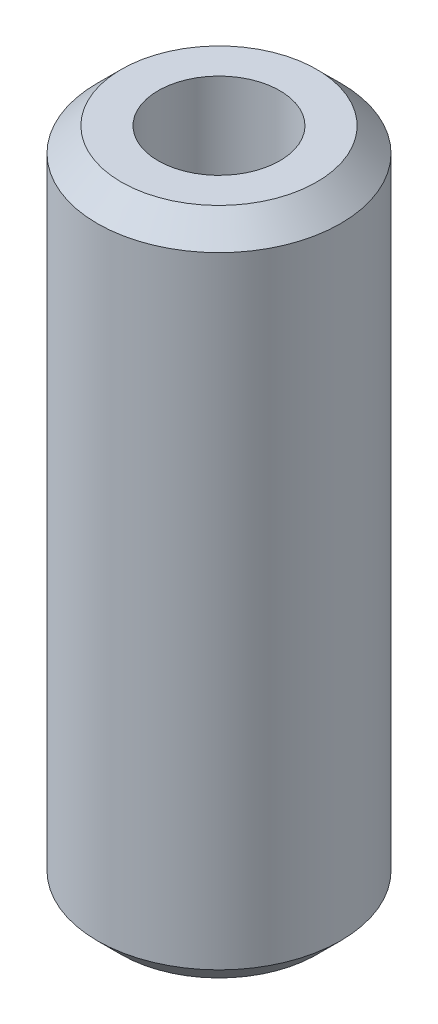
ISO-10303-21;
HEADER;
FILE_DESCRIPTION(('STEP AP214'),'2;1');
FILE_NAME('part.step','',(''),(''),'','','');
FILE_SCHEMA(('AUTOMOTIVE_DESIGN { 1 0 10303 214 1 1 1 1 }'));
ENDSEC;
DATA;
#1=APPLICATION_CONTEXT('core data for automotive mechanical design processes');
#2=APPLICATION_PROTOCOL_DEFINITION('international standard','automotive_design',2000,#1);
#3=PRODUCT_CONTEXT('',#1,'mechanical');
#4=PRODUCT('Part','Part','',(#3));
#5=PRODUCT_RELATED_PRODUCT_CATEGORY('part','',(#4));
#6=PRODUCT_DEFINITION_FORMATION('','',#4);
#7=PRODUCT_DEFINITION_CONTEXT('part definition',#1,'design');
#8=PRODUCT_DEFINITION('design','',#6,#7);
#9=PRODUCT_DEFINITION_SHAPE('','',#8);
#10=(LENGTH_UNIT() NAMED_UNIT(*) SI_UNIT(.MILLI.,.METRE.));
#11=(NAMED_UNIT(*) PLANE_ANGLE_UNIT() SI_UNIT($,.RADIAN.));
#12=(NAMED_UNIT(*) SI_UNIT($,.STERADIAN.) SOLID_ANGLE_UNIT());
#13=UNCERTAINTY_MEASURE_WITH_UNIT(LENGTH_MEASURE(1.E-05),#10,'distance_accuracy_value','');
#14=(GEOMETRIC_REPRESENTATION_CONTEXT(3) GLOBAL_UNCERTAINTY_ASSIGNED_CONTEXT((#13)) GLOBAL_UNIT_ASSIGNED_CONTEXT((#10,
#11,#12)) REPRESENTATION_CONTEXT('',''));
#15=CARTESIAN_POINT('',(0.,0.,0.));
#16=DIRECTION('',(0.,0.,1.));
#17=DIRECTION('',(1.,0.,0.));
#18=AXIS2_PLACEMENT_3D('',#15,#16,#17);
#19=CARTESIAN_POINT('',(0.,18.142839,0.));
#20=DIRECTION('',(0.,1.,0.));
#21=DIRECTION('',(0.,0.,1.));
#22=AXIS2_PLACEMENT_3D('',#19,#20,#21);
#23=PLANE('',#22);
#24=CARTESIAN_POINT('',(0.,18.142839,0.));
#25=DIRECTION('',(0.,1.,0.));
#26=DIRECTION('',(0.,0.,1.));
#27=AXIS2_PLACEMENT_3D('',#24,#25,#26);
#28=CIRCLE('',#27,5.298696);
#29=CARTESIAN_POINT('',(0.,18.142839,5.298696));
#30=VERTEX_POINT('',#29);
#31=EDGE_CURVE('E10',#30,#30,#28,.T.);
#32=ORIENTED_EDGE('',*,*,#31,.T.);
#33=EDGE_LOOP('',(#32));
#34=FACE_BOUND('',#33,.T.);
#35=CARTESIAN_POINT('',(0.,18.142839,0.));
#36=DIRECTION('',(0.,1.,0.));
#37=DIRECTION('',(0.,0.,1.));
#38=AXIS2_PLACEMENT_3D('',#35,#36,#37);
#39=CIRCLE('',#38,3.298698);
#40=CARTESIAN_POINT('',(0.,18.142839,3.298698));
#41=VERTEX_POINT('',#40);
#42=EDGE_CURVE('E62',#41,#41,#39,.T.);
#43=ORIENTED_EDGE('',*,*,#42,.F.);
#44=EDGE_LOOP('',(#43));
#45=FACE_BOUND('',#44,.T.);
#46=ADVANCED_FACE('F38',(#34,#45),#23,.T.);
#47=CARTESIAN_POINT('',(0.,-18.142839,0.));
#48=DIRECTION('',(0.,1.,0.));
#49=DIRECTION('',(0.,0.,1.));
#50=AXIS2_PLACEMENT_3D('',#47,#48,#49);
#51=PLANE('',#50);
#52=CARTESIAN_POINT('',(0.,-18.142839,0.));
#53=DIRECTION('',(0.,1.,0.));
#54=DIRECTION('',(0.,0.,1.));
#55=AXIS2_PLACEMENT_3D('',#52,#53,#54);
#56=CIRCLE('',#55,5.298696);
#57=CARTESIAN_POINT('',(0.,-18.142839,5.298696));
#58=VERTEX_POINT('',#57);
#59=EDGE_CURVE('E46',#58,#58,#56,.F.);
#60=ORIENTED_EDGE('',*,*,#59,.T.);
#61=EDGE_LOOP('',(#60));
#62=FACE_BOUND('',#61,.T.);
#63=CARTESIAN_POINT('',(0.,-18.142839,0.));
#64=DIRECTION('',(0.,1.,0.));
#65=DIRECTION('',(0.,0.,1.));
#66=AXIS2_PLACEMENT_3D('',#63,#64,#65);
#67=CIRCLE('',#66,3.298698);
#68=CARTESIAN_POINT('',(0.,-18.142839,3.298698));
#69=VERTEX_POINT('',#68);
#70=EDGE_CURVE('E63',#69,#69,#67,.T.);
#71=ORIENTED_EDGE('',*,*,#70,.T.);
#72=EDGE_LOOP('',(#71));
#73=FACE_BOUND('',#72,.T.);
#74=ADVANCED_FACE('F75',(#62,#73),#51,.F.);
#75=CARTESIAN_POINT('',(0.,18.142839,0.));
#76=DIRECTION('',(0.,-1.,0.));
#77=DIRECTION('',(0.,0.,-1.));
#78=AXIS2_PLACEMENT_3D('',#75,#76,#77);
#79=CYLINDRICAL_SURFACE('',#78,6.597396);
#80=CARTESIAN_POINT('',(0.,-16.844139,0.));
#81=DIRECTION('',(0.,1.,0.));
#82=DIRECTION('',(0.,0.,1.));
#83=AXIS2_PLACEMENT_3D('',#80,#81,#82);
#84=CIRCLE('',#83,6.597396);
#85=CARTESIAN_POINT('',(0.,-16.844139,6.597396));
#86=VERTEX_POINT('',#85);
#87=EDGE_CURVE('E51',#86,#86,#84,.T.);
#88=ORIENTED_EDGE('',*,*,#87,.T.);
#89=EDGE_LOOP('',(#88));
#90=FACE_BOUND('',#89,.T.);
#91=CARTESIAN_POINT('',(0.,16.844139,0.));
#92=DIRECTION('',(0.,1.,0.));
#93=DIRECTION('',(0.,0.,1.));
#94=AXIS2_PLACEMENT_3D('',#91,#92,#93);
#95=CIRCLE('',#94,6.597396);
#96=CARTESIAN_POINT('',(0.,16.844139,6.597396));
#97=VERTEX_POINT('',#96);
#98=EDGE_CURVE('E56',#97,#97,#95,.F.);
#99=ORIENTED_EDGE('',*,*,#98,.T.);
#100=EDGE_LOOP('',(#99));
#101=FACE_BOUND('',#100,.T.);
#102=ADVANCED_FACE('F80',(#90,#101),#79,.T.);
#103=CARTESIAN_POINT('',(0.,18.142839,0.));
#104=DIRECTION('',(0.,-1.,0.));
#105=DIRECTION('',(0.,0.,-1.));
#106=AXIS2_PLACEMENT_3D('',#103,#104,#105);
#107=CYLINDRICAL_SURFACE('',#106,3.298698);
#108=ORIENTED_EDGE('',*,*,#42,.T.);
#109=EDGE_LOOP('',(#108));
#110=FACE_BOUND('',#109,.T.);
#111=ORIENTED_EDGE('',*,*,#70,.F.);
#112=EDGE_LOOP('',(#111));
#113=FACE_BOUND('',#112,.T.);
#114=ADVANCED_FACE('F71',(#110,#113),#107,.F.);
#115=CARTESIAN_POINT('',(0.,-16.844139,0.));
#116=DIRECTION('',(0.,1.,0.));
#117=DIRECTION('',(0.,0.,1.));
#118=AXIS2_PLACEMENT_3D('',#115,#116,#117);
#119=CONICAL_SURFACE('',#118,6.597396,0.785398163397449);
#120=ORIENTED_EDGE('',*,*,#59,.F.);
#121=EDGE_LOOP('',(#120));
#122=FACE_BOUND('',#121,.T.);
#123=ORIENTED_EDGE('',*,*,#87,.F.);
#124=EDGE_LOOP('',(#123));
#125=FACE_BOUND('',#124,.T.);
#126=ADVANCED_FACE('F86',(#122,#125),#119,.T.);
#127=CARTESIAN_POINT('',(0.,18.142839,0.));
#128=DIRECTION('',(0.,-1.,0.));
#129=DIRECTION('',(0.,0.,-1.));
#130=AXIS2_PLACEMENT_3D('',#127,#128,#129);
#131=CONICAL_SURFACE('',#130,5.298696,0.785398163397446);
#132=ORIENTED_EDGE('',*,*,#98,.F.);
#133=EDGE_LOOP('',(#132));
#134=FACE_BOUND('',#133,.T.);
#135=ORIENTED_EDGE('',*,*,#31,.F.);
#136=EDGE_LOOP('',(#135));
#137=FACE_BOUND('',#136,.T.);
#138=ADVANCED_FACE('F40',(#134,#137),#131,.T.);
#139=CLOSED_SHELL('',(#46,#74,#102,#114,#126,#138));
#140=MANIFOLD_SOLID_BREP('B2',#139);
#141=ADVANCED_BREP_SHAPE_REPRESENTATION('',(#18,#140),#14);
#142=SHAPE_DEFINITION_REPRESENTATION(#9,#141);
ENDSEC;
END-ISO-10303-21;
